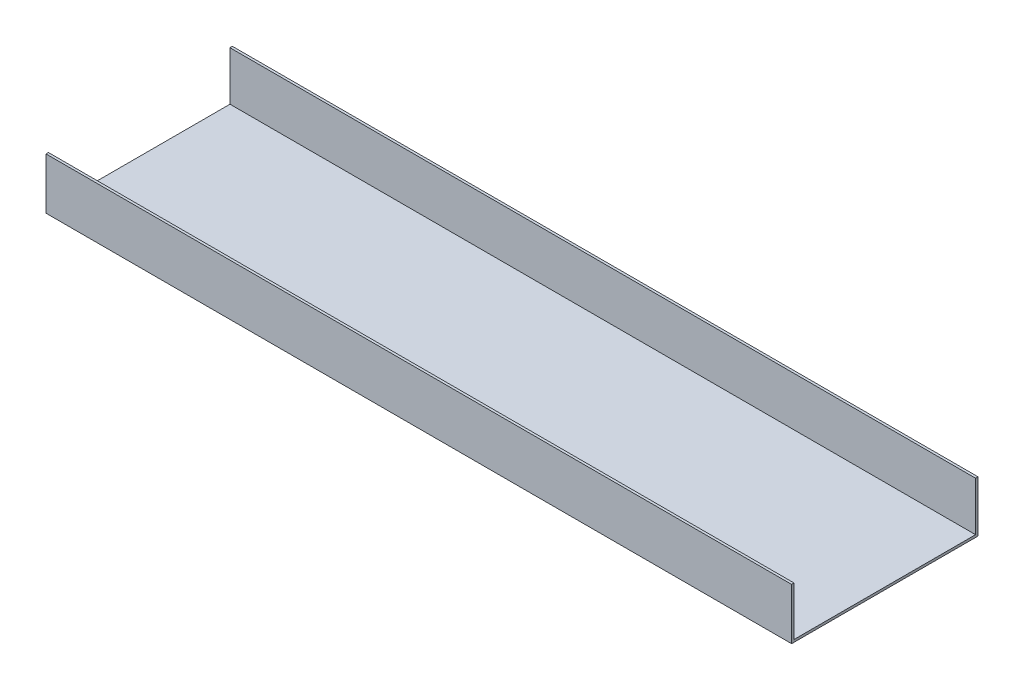
ISO-10303-21;
HEADER;
FILE_DESCRIPTION(('STEP AP214'),'2;1');
FILE_NAME('part.step','',(''),(''),'','','');
FILE_SCHEMA(('AUTOMOTIVE_DESIGN { 1 0 10303 214 1 1 1 1 }'));
ENDSEC;
DATA;
#1=APPLICATION_CONTEXT('core data for automotive mechanical design processes');
#2=APPLICATION_PROTOCOL_DEFINITION('international standard','automotive_design',2000,#1);
#3=PRODUCT_CONTEXT('',#1,'mechanical');
#4=PRODUCT('Part','Part','',(#3));
#5=PRODUCT_RELATED_PRODUCT_CATEGORY('part','',(#4));
#6=PRODUCT_DEFINITION_FORMATION('','',#4);
#7=PRODUCT_DEFINITION_CONTEXT('part definition',#1,'design');
#8=PRODUCT_DEFINITION('design','',#6,#7);
#9=PRODUCT_DEFINITION_SHAPE('','',#8);
#10=(LENGTH_UNIT() NAMED_UNIT(*) SI_UNIT(.MILLI.,.METRE.));
#11=(NAMED_UNIT(*) PLANE_ANGLE_UNIT() SI_UNIT($,.RADIAN.));
#12=(NAMED_UNIT(*) SI_UNIT($,.STERADIAN.) SOLID_ANGLE_UNIT());
#13=UNCERTAINTY_MEASURE_WITH_UNIT(LENGTH_MEASURE(1.E-05),#10,'distance_accuracy_value','');
#14=(GEOMETRIC_REPRESENTATION_CONTEXT(3) GLOBAL_UNCERTAINTY_ASSIGNED_CONTEXT((#13)) GLOBAL_UNIT_ASSIGNED_CONTEXT((#10,
#11,#12)) REPRESENTATION_CONTEXT('',''));
#15=CARTESIAN_POINT('',(0.,0.,0.));
#16=DIRECTION('',(0.,0.,1.));
#17=DIRECTION('',(1.,0.,0.));
#18=AXIS2_PLACEMENT_3D('',#15,#16,#17);
#19=CARTESIAN_POINT('',(0.,1.,0.));
#20=DIRECTION('',(0.,1.,0.));
#21=DIRECTION('',(0.,0.,1.));
#22=AXIS2_PLACEMENT_3D('',#19,#20,#21);
#23=PLANE('',#22);
#24=DIRECTION('',(0.,0.,-1.));
#25=VECTOR('',#24,1.);
#26=CARTESIAN_POINT('',(152.4,1.,-38.1));
#27=LINE('',#26,#25);
#28=CARTESIAN_POINT('',(152.4,1.,37.1));
#29=VERTEX_POINT('',#28);
#30=CARTESIAN_POINT('',(152.4,1.,-37.1));
#31=VERTEX_POINT('',#30);
#32=EDGE_CURVE('E52',#29,#31,#27,.T.);
#33=ORIENTED_EDGE('',*,*,#32,.T.);
#34=DIRECTION('',(1.,0.,0.));
#35=VECTOR('',#34,1.);
#36=CARTESIAN_POINT('',(-152.4,1.,-37.1));
#37=LINE('',#36,#35);
#38=CARTESIAN_POINT('',(-152.4,1.,-37.1));
#39=VERTEX_POINT('',#38);
#40=EDGE_CURVE('E116',#39,#31,#37,.T.);
#41=ORIENTED_EDGE('',*,*,#40,.F.);
#42=DIRECTION('',(0.,0.,1.));
#43=VECTOR('',#42,1.);
#44=CARTESIAN_POINT('',(-152.4,1.,-38.1));
#45=LINE('',#44,#43);
#46=CARTESIAN_POINT('',(-152.4,1.,37.1));
#47=VERTEX_POINT('',#46);
#48=EDGE_CURVE('E151',#39,#47,#45,.T.);
#49=ORIENTED_EDGE('',*,*,#48,.T.);
#50=DIRECTION('',(1.,0.,0.));
#51=VECTOR('',#50,1.);
#52=CARTESIAN_POINT('',(-152.4,1.,37.1));
#53=LINE('',#52,#51);
#54=EDGE_CURVE('E122',#47,#29,#53,.T.);
#55=ORIENTED_EDGE('',*,*,#54,.T.);
#56=EDGE_LOOP('',(#33,#41,#49,#55));
#57=FACE_BOUND('',#56,.T.);
#58=ADVANCED_FACE('F37',(#57),#23,.T.);
#59=CARTESIAN_POINT('',(152.4,1.,-38.1));
#60=DIRECTION('',(-1.,0.,0.));
#61=DIRECTION('',(0.,0.,1.));
#62=AXIS2_PLACEMENT_3D('',#59,#60,#61);
#63=PLANE('',#62);
#64=DIRECTION('',(0.,0.,-1.));
#65=VECTOR('',#64,1.);
#66=CARTESIAN_POINT('',(152.4,0.,-38.1));
#67=LINE('',#66,#65);
#68=CARTESIAN_POINT('',(152.4,0.,38.1));
#69=VERTEX_POINT('',#68);
#70=CARTESIAN_POINT('',(152.4,0.,-38.1));
#71=VERTEX_POINT('',#70);
#72=EDGE_CURVE('E149',#69,#71,#67,.T.);
#73=ORIENTED_EDGE('',*,*,#72,.T.);
#74=DIRECTION('',(0.,-1.,0.));
#75=VECTOR('',#74,1.);
#76=CARTESIAN_POINT('',(152.4,1.,-38.1));
#77=LINE('',#76,#75);
#78=CARTESIAN_POINT('',(152.4,21.,-38.1));
#79=VERTEX_POINT('',#78);
#80=EDGE_CURVE('E11',#79,#71,#77,.T.);
#81=ORIENTED_EDGE('',*,*,#80,.F.);
#82=DIRECTION('',(0.,0.,1.));
#83=VECTOR('',#82,1.);
#84=CARTESIAN_POINT('',(152.4,21.,-38.1));
#85=LINE('',#84,#83);
#86=CARTESIAN_POINT('',(152.4,21.,-37.1));
#87=VERTEX_POINT('',#86);
#88=EDGE_CURVE('E110',#79,#87,#85,.T.);
#89=ORIENTED_EDGE('',*,*,#88,.T.);
#90=DIRECTION('',(0.,-1.,0.));
#91=VECTOR('',#90,1.);
#92=CARTESIAN_POINT('',(152.4,21.,-37.1));
#93=LINE('',#92,#91);
#94=EDGE_CURVE('E119',#87,#31,#93,.T.);
#95=ORIENTED_EDGE('',*,*,#94,.T.);
#96=ORIENTED_EDGE('',*,*,#32,.F.);
#97=DIRECTION('',(0.,-1.,0.));
#98=VECTOR('',#97,1.);
#99=CARTESIAN_POINT('',(152.4,21.,37.1));
#100=LINE('',#99,#98);
#101=CARTESIAN_POINT('',(152.4,21.,37.1));
#102=VERTEX_POINT('',#101);
#103=EDGE_CURVE('E60',#102,#29,#100,.T.);
#104=ORIENTED_EDGE('',*,*,#103,.F.);
#105=DIRECTION('',(0.,0.,1.));
#106=VECTOR('',#105,1.);
#107=CARTESIAN_POINT('',(152.4,21.,37.1));
#108=LINE('',#107,#106);
#109=CARTESIAN_POINT('',(152.4,21.,38.1));
#110=VERTEX_POINT('',#109);
#111=EDGE_CURVE('E136',#102,#110,#108,.T.);
#112=ORIENTED_EDGE('',*,*,#111,.T.);
#113=DIRECTION('',(0.,-1.,0.));
#114=VECTOR('',#113,1.);
#115=CARTESIAN_POINT('',(152.4,1.,38.1));
#116=LINE('',#115,#114);
#117=EDGE_CURVE('E154',#110,#69,#116,.T.);
#118=ORIENTED_EDGE('',*,*,#117,.T.);
#119=EDGE_LOOP('',(#73,#81,#89,#95,#96,#104,#112,#118));
#120=FACE_BOUND('',#119,.T.);
#121=ADVANCED_FACE('F39',(#120),#63,.F.);
#122=CARTESIAN_POINT('',(-152.4,1.,-38.1));
#123=DIRECTION('',(0.,0.,1.));
#124=DIRECTION('',(1.,0.,0.));
#125=AXIS2_PLACEMENT_3D('',#122,#123,#124);
#126=PLANE('',#125);
#127=DIRECTION('',(-1.,0.,0.));
#128=VECTOR('',#127,1.);
#129=CARTESIAN_POINT('',(-152.4,0.,-38.1));
#130=LINE('',#129,#128);
#131=CARTESIAN_POINT('',(-152.4,0.,-38.1));
#132=VERTEX_POINT('',#131);
#133=EDGE_CURVE('E156',#71,#132,#130,.T.);
#134=ORIENTED_EDGE('',*,*,#133,.T.);
#135=DIRECTION('',(0.,-1.,0.));
#136=VECTOR('',#135,1.);
#137=CARTESIAN_POINT('',(-152.4,1.,-38.1));
#138=LINE('',#137,#136);
#139=CARTESIAN_POINT('',(-152.4,21.,-38.1));
#140=VERTEX_POINT('',#139);
#141=EDGE_CURVE('E45',#140,#132,#138,.T.);
#142=ORIENTED_EDGE('',*,*,#141,.F.);
#143=DIRECTION('',(1.,0.,0.));
#144=VECTOR('',#143,1.);
#145=CARTESIAN_POINT('',(-152.4,21.,-38.1));
#146=LINE('',#145,#144);
#147=EDGE_CURVE('E126',#140,#79,#146,.T.);
#148=ORIENTED_EDGE('',*,*,#147,.T.);
#149=ORIENTED_EDGE('',*,*,#80,.T.);
#150=EDGE_LOOP('',(#134,#142,#148,#149));
#151=FACE_BOUND('',#150,.T.);
#152=ADVANCED_FACE('F188',(#151),#126,.F.);
#153=CARTESIAN_POINT('',(-152.4,1.,-38.1));
#154=DIRECTION('',(1.,0.,0.));
#155=DIRECTION('',(0.,0.,-1.));
#156=AXIS2_PLACEMENT_3D('',#153,#154,#155);
#157=PLANE('',#156);
#158=DIRECTION('',(0.,0.,1.));
#159=VECTOR('',#158,1.);
#160=CARTESIAN_POINT('',(-152.4,0.,-38.1));
#161=LINE('',#160,#159);
#162=CARTESIAN_POINT('',(-152.4,0.,38.1));
#163=VERTEX_POINT('',#162);
#164=EDGE_CURVE('E158',#132,#163,#161,.T.);
#165=ORIENTED_EDGE('',*,*,#164,.T.);
#166=DIRECTION('',(0.,-1.,0.));
#167=VECTOR('',#166,1.);
#168=CARTESIAN_POINT('',(-152.4,1.,38.1));
#169=LINE('',#168,#167);
#170=CARTESIAN_POINT('',(-152.4,21.,38.1));
#171=VERTEX_POINT('',#170);
#172=EDGE_CURVE('E163',#171,#163,#169,.T.);
#173=ORIENTED_EDGE('',*,*,#172,.F.);
#174=DIRECTION('',(0.,0.,-1.));
#175=VECTOR('',#174,1.);
#176=CARTESIAN_POINT('',(-152.4,21.,38.1));
#177=LINE('',#176,#175);
#178=CARTESIAN_POINT('',(-152.4,21.,37.1));
#179=VERTEX_POINT('',#178);
#180=EDGE_CURVE('E141',#171,#179,#177,.T.);
#181=ORIENTED_EDGE('',*,*,#180,.T.);
#182=DIRECTION('',(0.,-1.,0.));
#183=VECTOR('',#182,1.);
#184=CARTESIAN_POINT('',(-152.4,21.,37.1));
#185=LINE('',#184,#183);
#186=EDGE_CURVE('E144',#179,#47,#185,.T.);
#187=ORIENTED_EDGE('',*,*,#186,.T.);
#188=ORIENTED_EDGE('',*,*,#48,.F.);
#189=DIRECTION('',(0.,-1.,0.));
#190=VECTOR('',#189,1.);
#191=CARTESIAN_POINT('',(-152.4,21.,-37.1));
#192=LINE('',#191,#190);
#193=CARTESIAN_POINT('',(-152.4,21.,-37.1));
#194=VERTEX_POINT('',#193);
#195=EDGE_CURVE('E123',#194,#39,#192,.T.);
#196=ORIENTED_EDGE('',*,*,#195,.F.);
#197=DIRECTION('',(0.,0.,-1.));
#198=VECTOR('',#197,1.);
#199=CARTESIAN_POINT('',(-152.4,21.,-37.1));
#200=LINE('',#199,#198);
#201=EDGE_CURVE('E113',#194,#140,#200,.T.);
#202=ORIENTED_EDGE('',*,*,#201,.T.);
#203=ORIENTED_EDGE('',*,*,#141,.T.);
#204=EDGE_LOOP('',(#165,#173,#181,#187,#188,#196,#202,#203));
#205=FACE_BOUND('',#204,.T.);
#206=ADVANCED_FACE('F168',(#205),#157,.F.);
#207=CARTESIAN_POINT('',(-152.4,1.,38.1));
#208=DIRECTION('',(0.,0.,-1.));
#209=DIRECTION('',(-1.,0.,0.));
#210=AXIS2_PLACEMENT_3D('',#207,#208,#209);
#211=PLANE('',#210);
#212=DIRECTION('',(1.,0.,0.));
#213=VECTOR('',#212,1.);
#214=CARTESIAN_POINT('',(-152.4,0.,38.1));
#215=LINE('',#214,#213);
#216=EDGE_CURVE('E152',#163,#69,#215,.T.);
#217=ORIENTED_EDGE('',*,*,#216,.T.);
#218=ORIENTED_EDGE('',*,*,#117,.F.);
#219=DIRECTION('',(1.,0.,0.));
#220=VECTOR('',#219,1.);
#221=CARTESIAN_POINT('',(-152.4,21.,38.1));
#222=LINE('',#221,#220);
#223=EDGE_CURVE('E133',#171,#110,#222,.T.);
#224=ORIENTED_EDGE('',*,*,#223,.F.);
#225=ORIENTED_EDGE('',*,*,#172,.T.);
#226=EDGE_LOOP('',(#217,#218,#224,#225));
#227=FACE_BOUND('',#226,.T.);
#228=ADVANCED_FACE('F175',(#227),#211,.F.);
#229=CARTESIAN_POINT('',(0.,0.,0.));
#230=DIRECTION('',(0.,1.,0.));
#231=DIRECTION('',(0.,0.,1.));
#232=AXIS2_PLACEMENT_3D('',#229,#230,#231);
#233=PLANE('',#232);
#234=ORIENTED_EDGE('',*,*,#72,.F.);
#235=ORIENTED_EDGE('',*,*,#216,.F.);
#236=ORIENTED_EDGE('',*,*,#164,.F.);
#237=ORIENTED_EDGE('',*,*,#133,.F.);
#238=EDGE_LOOP('',(#234,#235,#236,#237));
#239=FACE_BOUND('',#238,.T.);
#240=ADVANCED_FACE('F173',(#239),#233,.F.);
#241=CARTESIAN_POINT('',(-152.4,21.,37.1));
#242=DIRECTION('',(0.,0.,-1.));
#243=DIRECTION('',(-1.,0.,0.));
#244=AXIS2_PLACEMENT_3D('',#241,#242,#243);
#245=PLANE('',#244);
#246=ORIENTED_EDGE('',*,*,#54,.F.);
#247=ORIENTED_EDGE('',*,*,#186,.F.);
#248=DIRECTION('',(1.,0.,0.));
#249=VECTOR('',#248,1.);
#250=CARTESIAN_POINT('',(-152.4,21.,37.1));
#251=LINE('',#250,#249);
#252=EDGE_CURVE('E139',#179,#102,#251,.T.);
#253=ORIENTED_EDGE('',*,*,#252,.T.);
#254=ORIENTED_EDGE('',*,*,#103,.T.);
#255=EDGE_LOOP('',(#246,#247,#253,#254));
#256=FACE_BOUND('',#255,.T.);
#257=ADVANCED_FACE('F182',(#256),#245,.T.);
#258=CARTESIAN_POINT('',(0.,21.,0.));
#259=DIRECTION('',(0.,-1.,0.));
#260=DIRECTION('',(-1.,0.,0.));
#261=AXIS2_PLACEMENT_3D('',#258,#259,#260);
#262=PLANE('',#261);
#263=ORIENTED_EDGE('',*,*,#223,.T.);
#264=ORIENTED_EDGE('',*,*,#111,.F.);
#265=ORIENTED_EDGE('',*,*,#252,.F.);
#266=ORIENTED_EDGE('',*,*,#180,.F.);
#267=EDGE_LOOP('',(#263,#264,#265,#266));
#268=FACE_BOUND('',#267,.T.);
#269=ADVANCED_FACE('F180',(#268),#262,.F.);
#270=CARTESIAN_POINT('',(-152.4,21.,-37.1));
#271=DIRECTION('',(0.,0.,-1.));
#272=DIRECTION('',(-1.,0.,0.));
#273=AXIS2_PLACEMENT_3D('',#270,#271,#272);
#274=PLANE('',#273);
#275=ORIENTED_EDGE('',*,*,#40,.T.);
#276=ORIENTED_EDGE('',*,*,#94,.F.);
#277=DIRECTION('',(1.,0.,0.));
#278=VECTOR('',#277,1.);
#279=CARTESIAN_POINT('',(-152.4,21.,-37.1));
#280=LINE('',#279,#278);
#281=EDGE_CURVE('E105',#194,#87,#280,.T.);
#282=ORIENTED_EDGE('',*,*,#281,.F.);
#283=ORIENTED_EDGE('',*,*,#195,.T.);
#284=EDGE_LOOP('',(#275,#276,#282,#283));
#285=FACE_BOUND('',#284,.T.);
#286=ADVANCED_FACE('F120',(#285),#274,.F.);
#287=CARTESIAN_POINT('',(0.,21.,0.));
#288=DIRECTION('',(0.,-1.,0.));
#289=DIRECTION('',(-1.,0.,0.));
#290=AXIS2_PLACEMENT_3D('',#287,#288,#289);
#291=PLANE('',#290);
#292=ORIENTED_EDGE('',*,*,#281,.T.);
#293=ORIENTED_EDGE('',*,*,#88,.F.);
#294=ORIENTED_EDGE('',*,*,#147,.F.);
#295=ORIENTED_EDGE('',*,*,#201,.F.);
#296=EDGE_LOOP('',(#292,#293,#294,#295));
#297=FACE_BOUND('',#296,.T.);
#298=ADVANCED_FACE('F107',(#297),#291,.F.);
#299=CLOSED_SHELL('',(#58,#121,#152,#206,#228,#240,#257,#269,#286,#298));
#300=MANIFOLD_SOLID_BREP('B2',#299);
#301=ADVANCED_BREP_SHAPE_REPRESENTATION('',(#18,#300),#14);
#302=SHAPE_DEFINITION_REPRESENTATION(#9,#301);
ENDSEC;
END-ISO-10303-21;
